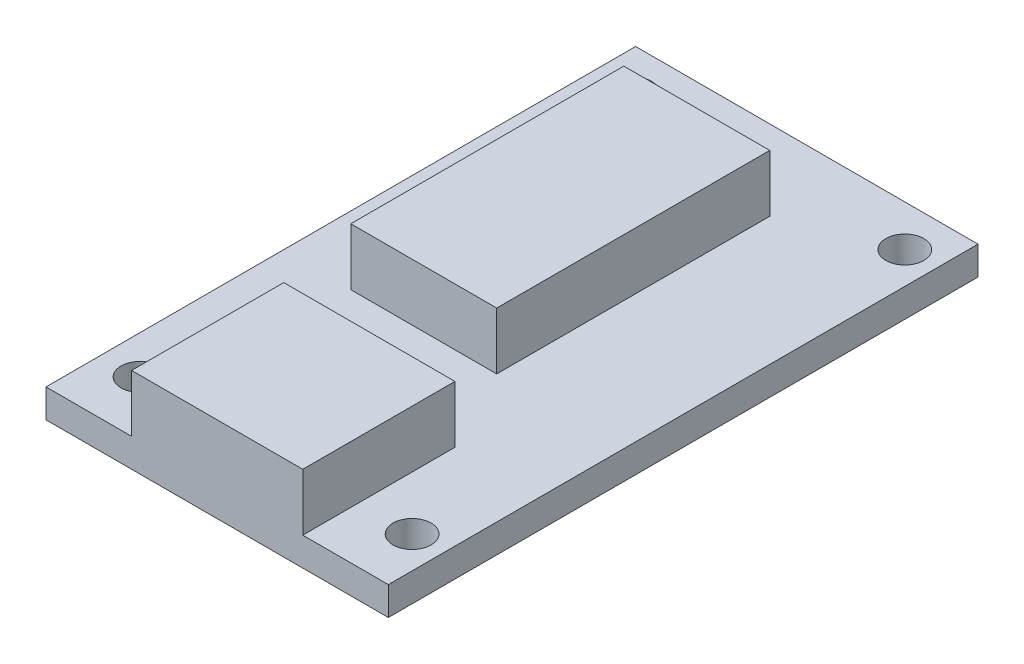
ISO-10303-21;
HEADER;
FILE_DESCRIPTION(('STEP AP214'),'2;1');
FILE_NAME('part.step','',(''),(''),'','','');
FILE_SCHEMA(('AUTOMOTIVE_DESIGN { 1 0 10303 214 1 1 1 1 }'));
ENDSEC;
DATA;
#1=APPLICATION_CONTEXT('core data for automotive mechanical design processes');
#2=APPLICATION_PROTOCOL_DEFINITION('international standard','automotive_design',2000,#1);
#3=PRODUCT_CONTEXT('',#1,'mechanical');
#4=PRODUCT('Part','Part','',(#3));
#5=PRODUCT_RELATED_PRODUCT_CATEGORY('part','',(#4));
#6=PRODUCT_DEFINITION_FORMATION('','',#4);
#7=PRODUCT_DEFINITION_CONTEXT('part definition',#1,'design');
#8=PRODUCT_DEFINITION('design','',#6,#7);
#9=PRODUCT_DEFINITION_SHAPE('','',#8);
#10=(LENGTH_UNIT() NAMED_UNIT(*) SI_UNIT(.MILLI.,.METRE.));
#11=(NAMED_UNIT(*) PLANE_ANGLE_UNIT() SI_UNIT($,.RADIAN.));
#12=(NAMED_UNIT(*) SI_UNIT($,.STERADIAN.) SOLID_ANGLE_UNIT());
#13=UNCERTAINTY_MEASURE_WITH_UNIT(LENGTH_MEASURE(1.E-05),#10,'distance_accuracy_value','');
#14=(GEOMETRIC_REPRESENTATION_CONTEXT(3) GLOBAL_UNCERTAINTY_ASSIGNED_CONTEXT((#13)) GLOBAL_UNIT_ASSIGNED_CONTEXT((#10,
#11,#12)) REPRESENTATION_CONTEXT('',''));
#15=CARTESIAN_POINT('',(0.,0.,0.));
#16=DIRECTION('',(0.,0.,1.));
#17=DIRECTION('',(1.,0.,0.));
#18=AXIS2_PLACEMENT_3D('',#15,#16,#17);
#19=CARTESIAN_POINT('',(0.,1.5,0.));
#20=DIRECTION('',(0.,1.,0.));
#21=DIRECTION('',(0.,0.,1.));
#22=AXIS2_PLACEMENT_3D('',#19,#20,#21);
#23=PLANE('',#22);
#24=CARTESIAN_POINT('',(16.3202285056813,1.5,-2.92692740810944));
#25=DIRECTION('',(0.,1.,0.));
#26=DIRECTION('',(0.,0.,1.));
#27=AXIS2_PLACEMENT_3D('',#24,#25,#26);
#28=CIRCLE('',#27,1.);
#29=CARTESIAN_POINT('',(16.3202285056813,1.5,-1.92692740810943));
#30=VERTEX_POINT('',#29);
#31=EDGE_CURVE('E249',#30,#30,#28,.T.);
#32=ORIENTED_EDGE('',*,*,#31,.F.);
#33=EDGE_LOOP('',(#32));
#34=FACE_BOUND('',#33,.T.);
#35=CARTESIAN_POINT('',(2.01730364443661,1.5,-28.8325199296558));
#36=DIRECTION('',(0.,1.,0.));
#37=DIRECTION('',(0.,0.,1.));
#38=AXIS2_PLACEMENT_3D('',#35,#36,#37);
#39=CIRCLE('',#38,1.);
#40=CARTESIAN_POINT('',(2.01730364443661,1.5,-27.8325199296558));
#41=VERTEX_POINT('',#40);
#42=EDGE_CURVE('E250',#41,#41,#39,.T.);
#43=ORIENTED_EDGE('',*,*,#42,.F.);
#44=EDGE_LOOP('',(#43));
#45=FACE_BOUND('',#44,.T.);
#46=CARTESIAN_POINT('',(16.3202285056813,1.5,-28.8325199296558));
#47=DIRECTION('',(0.,1.,0.));
#48=DIRECTION('',(0.,0.,1.));
#49=AXIS2_PLACEMENT_3D('',#46,#47,#48);
#50=CIRCLE('',#49,1.);
#51=CARTESIAN_POINT('',(16.3202285056813,1.5,-27.8325199296558));
#52=VERTEX_POINT('',#51);
#53=EDGE_CURVE('E253',#52,#52,#50,.T.);
#54=ORIENTED_EDGE('',*,*,#53,.F.);
#55=EDGE_LOOP('',(#54));
#56=FACE_BOUND('',#55,.T.);
#57=CARTESIAN_POINT('',(2.01730364443661,1.5,-2.92692740810944));
#58=DIRECTION('',(0.,1.,0.));
#59=DIRECTION('',(0.,0.,1.));
#60=AXIS2_PLACEMENT_3D('',#57,#58,#59);
#61=CIRCLE('',#60,1.);
#62=CARTESIAN_POINT('',(2.01730364443661,1.5,-1.92692740810944));
#63=VERTEX_POINT('',#62);
#64=EDGE_CURVE('E227',#63,#63,#61,.T.);
#65=ORIENTED_EDGE('',*,*,#64,.F.);
#66=EDGE_LOOP('',(#65));
#67=FACE_BOUND('',#66,.T.);
#68=DIRECTION('',(-1.,0.,0.));
#69=VECTOR('',#68,1.);
#70=CARTESIAN_POINT('',(0.,1.5,-8.));
#71=LINE('',#70,#69);
#72=CARTESIAN_POINT('',(13.5,1.5,-8.));
#73=VERTEX_POINT('',#72);
#74=CARTESIAN_POINT('',(4.5,1.5,-8.));
#75=VERTEX_POINT('',#74);
#76=EDGE_CURVE('E72',#73,#75,#71,.T.);
#77=ORIENTED_EDGE('',*,*,#76,.F.);
#78=DIRECTION('',(0.,0.,1.));
#79=VECTOR('',#78,1.);
#80=CARTESIAN_POINT('',(13.5,1.5,0.));
#81=LINE('',#80,#79);
#82=CARTESIAN_POINT('',(13.5,1.5,0.));
#83=VERTEX_POINT('',#82);
#84=EDGE_CURVE('E193',#73,#83,#81,.T.);
#85=ORIENTED_EDGE('',*,*,#84,.T.);
#86=DIRECTION('',(1.,0.,0.));
#87=VECTOR('',#86,1.);
#88=CARTESIAN_POINT('',(0.,1.5,0.));
#89=LINE('',#88,#87);
#90=CARTESIAN_POINT('',(18.,1.5,0.));
#91=VERTEX_POINT('',#90);
#92=EDGE_CURVE('E199',#83,#91,#89,.T.);
#93=ORIENTED_EDGE('',*,*,#92,.T.);
#94=DIRECTION('',(0.,0.,-1.));
#95=VECTOR('',#94,1.);
#96=CARTESIAN_POINT('',(18.,1.5,0.));
#97=LINE('',#96,#95);
#98=CARTESIAN_POINT('',(18.,1.5,-31.));
#99=VERTEX_POINT('',#98);
#100=EDGE_CURVE('E203',#91,#99,#97,.T.);
#101=ORIENTED_EDGE('',*,*,#100,.T.);
#102=DIRECTION('',(1.,0.,0.));
#103=VECTOR('',#102,1.);
#104=CARTESIAN_POINT('',(0.,1.5,-31.));
#105=LINE('',#104,#103);
#106=CARTESIAN_POINT('',(0.,1.5,-31.));
#107=VERTEX_POINT('',#106);
#108=EDGE_CURVE('E205',#107,#99,#105,.T.);
#109=ORIENTED_EDGE('',*,*,#108,.F.);
#110=DIRECTION('',(0.,0.,-1.));
#111=VECTOR('',#110,1.);
#112=CARTESIAN_POINT('',(0.,1.5,0.));
#113=LINE('',#112,#111);
#114=CARTESIAN_POINT('',(0.,1.5,0.));
#115=VERTEX_POINT('',#114);
#116=EDGE_CURVE('E196',#115,#107,#113,.T.);
#117=ORIENTED_EDGE('',*,*,#116,.F.);
#118=CARTESIAN_POINT('',(4.5,1.5,0.));
#119=VERTEX_POINT('',#118);
#120=EDGE_CURVE('E201',#115,#119,#89,.T.);
#121=ORIENTED_EDGE('',*,*,#120,.T.);
#122=DIRECTION('',(0.,0.,1.));
#123=VECTOR('',#122,1.);
#124=CARTESIAN_POINT('',(4.5,1.5,0.));
#125=LINE('',#124,#123);
#126=EDGE_CURVE('E189',#75,#119,#125,.T.);
#127=ORIENTED_EDGE('',*,*,#126,.F.);
#128=EDGE_LOOP('',(#77,#85,#93,#101,#109,#117,#121,#127));
#129=FACE_BOUND('',#128,.T.);
#130=DIRECTION('',(1.,0.,0.));
#131=VECTOR('',#130,1.);
#132=CARTESIAN_POINT('',(3.58371132864352,1.5,-12.4392175838739));
#133=LINE('',#132,#131);
#134=CARTESIAN_POINT('',(3.58371132864352,1.5,-12.4392175838739));
#135=VERTEX_POINT('',#134);
#136=CARTESIAN_POINT('',(11.2572221747062,1.5,-12.4392175838739));
#137=VERTEX_POINT('',#136);
#138=EDGE_CURVE('E236',#135,#137,#133,.T.);
#139=ORIENTED_EDGE('',*,*,#138,.F.);
#140=DIRECTION('',(0.,0.,1.));
#141=VECTOR('',#140,1.);
#142=CARTESIAN_POINT('',(3.58371132864352,1.5,-26.7947182116203));
#143=LINE('',#142,#141);
#144=CARTESIAN_POINT('',(3.58371132864352,1.5,-26.7947182116203));
#145=VERTEX_POINT('',#144);
#146=EDGE_CURVE('E160',#145,#135,#143,.T.);
#147=ORIENTED_EDGE('',*,*,#146,.F.);
#148=DIRECTION('',(-1.,0.,0.));
#149=VECTOR('',#148,1.);
#150=CARTESIAN_POINT('',(3.58371132864352,1.5,-26.7947182116203));
#151=LINE('',#150,#149);
#152=CARTESIAN_POINT('',(11.2572221747062,1.5,-26.7947182116203));
#153=VERTEX_POINT('',#152);
#154=EDGE_CURVE('E156',#153,#145,#151,.T.);
#155=ORIENTED_EDGE('',*,*,#154,.F.);
#156=DIRECTION('',(0.,0.,-1.));
#157=VECTOR('',#156,1.);
#158=CARTESIAN_POINT('',(11.2572221747062,1.5,-26.7947182116203));
#159=LINE('',#158,#157);
#160=EDGE_CURVE('E238',#137,#153,#159,.T.);
#161=ORIENTED_EDGE('',*,*,#160,.F.);
#162=EDGE_LOOP('',(#139,#147,#155,#161));
#163=FACE_BOUND('',#162,.T.);
#164=ADVANCED_FACE('F47',(#34,#45,#56,#67,#129,#163),#23,.T.);
#165=CARTESIAN_POINT('',(0.,1.5,0.));
#166=DIRECTION('',(-1.,0.,0.));
#167=DIRECTION('',(0.,0.,1.));
#168=AXIS2_PLACEMENT_3D('',#165,#166,#167);
#169=PLANE('',#168);
#170=DIRECTION('',(0.,0.,-1.));
#171=VECTOR('',#170,1.);
#172=CARTESIAN_POINT('',(0.,0.,0.));
#173=LINE('',#172,#171);
#174=CARTESIAN_POINT('',(0.,0.,0.));
#175=VERTEX_POINT('',#174);
#176=CARTESIAN_POINT('',(0.,0.,-31.));
#177=VERTEX_POINT('',#176);
#178=EDGE_CURVE('E195',#175,#177,#173,.T.);
#179=ORIENTED_EDGE('',*,*,#178,.F.);
#180=DIRECTION('',(0.,-1.,0.));
#181=VECTOR('',#180,1.);
#182=CARTESIAN_POINT('',(0.,1.5,0.));
#183=LINE('',#182,#181);
#184=EDGE_CURVE('E11',#115,#175,#183,.T.);
#185=ORIENTED_EDGE('',*,*,#184,.F.);
#186=ORIENTED_EDGE('',*,*,#116,.T.);
#187=DIRECTION('',(0.,-1.,0.));
#188=VECTOR('',#187,1.);
#189=CARTESIAN_POINT('',(0.,1.5,-31.));
#190=LINE('',#189,#188);
#191=EDGE_CURVE('E208',#107,#177,#190,.T.);
#192=ORIENTED_EDGE('',*,*,#191,.T.);
#193=EDGE_LOOP('',(#179,#185,#186,#192));
#194=FACE_BOUND('',#193,.T.);
#195=ADVANCED_FACE('F49',(#194),#169,.T.);
#196=CARTESIAN_POINT('',(0.,1.5,0.));
#197=DIRECTION('',(0.,0.,-1.));
#198=DIRECTION('',(-1.,0.,0.));
#199=AXIS2_PLACEMENT_3D('',#196,#197,#198);
#200=PLANE('',#199);
#201=DIRECTION('',(1.,0.,0.));
#202=VECTOR('',#201,1.);
#203=CARTESIAN_POINT('',(0.,0.,0.));
#204=LINE('',#203,#202);
#205=CARTESIAN_POINT('',(18.,0.,0.));
#206=VERTEX_POINT('',#205);
#207=EDGE_CURVE('E211',#175,#206,#204,.T.);
#208=ORIENTED_EDGE('',*,*,#207,.T.);
#209=DIRECTION('',(0.,-1.,0.));
#210=VECTOR('',#209,1.);
#211=CARTESIAN_POINT('',(18.,1.5,0.));
#212=LINE('',#211,#210);
#213=EDGE_CURVE('E56',#91,#206,#212,.T.);
#214=ORIENTED_EDGE('',*,*,#213,.F.);
#215=ORIENTED_EDGE('',*,*,#92,.F.);
#216=DIRECTION('',(0.,-1.,0.));
#217=VECTOR('',#216,1.);
#218=CARTESIAN_POINT('',(13.5,4.5,0.));
#219=LINE('',#218,#217);
#220=CARTESIAN_POINT('',(13.5,4.5,0.));
#221=VERTEX_POINT('',#220);
#222=EDGE_CURVE('E186',#221,#83,#219,.T.);
#223=ORIENTED_EDGE('',*,*,#222,.F.);
#224=DIRECTION('',(1.,0.,0.));
#225=VECTOR('',#224,1.);
#226=CARTESIAN_POINT('',(0.,4.5,0.));
#227=LINE('',#226,#225);
#228=CARTESIAN_POINT('',(4.5,4.5,0.));
#229=VERTEX_POINT('',#228);
#230=EDGE_CURVE('E162',#229,#221,#227,.T.);
#231=ORIENTED_EDGE('',*,*,#230,.F.);
#232=DIRECTION('',(0.,-1.,0.));
#233=VECTOR('',#232,1.);
#234=CARTESIAN_POINT('',(4.5,4.5,0.));
#235=LINE('',#234,#233);
#236=EDGE_CURVE('E177',#229,#119,#235,.T.);
#237=ORIENTED_EDGE('',*,*,#236,.T.);
#238=ORIENTED_EDGE('',*,*,#120,.F.);
#239=ORIENTED_EDGE('',*,*,#184,.T.);
#240=EDGE_LOOP('',(#208,#214,#215,#223,#231,#237,#238,#239));
#241=FACE_BOUND('',#240,.T.);
#242=ADVANCED_FACE('F313',(#241),#200,.F.);
#243=CARTESIAN_POINT('',(18.,1.5,0.));
#244=DIRECTION('',(-1.,0.,0.));
#245=DIRECTION('',(0.,0.,1.));
#246=AXIS2_PLACEMENT_3D('',#243,#244,#245);
#247=PLANE('',#246);
#248=DIRECTION('',(0.,0.,-1.));
#249=VECTOR('',#248,1.);
#250=CARTESIAN_POINT('',(18.,0.,0.));
#251=LINE('',#250,#249);
#252=CARTESIAN_POINT('',(18.,0.,-31.));
#253=VERTEX_POINT('',#252);
#254=EDGE_CURVE('E213',#206,#253,#251,.T.);
#255=ORIENTED_EDGE('',*,*,#254,.T.);
#256=DIRECTION('',(0.,-1.,0.));
#257=VECTOR('',#256,1.);
#258=CARTESIAN_POINT('',(18.,1.5,-31.));
#259=LINE('',#258,#257);
#260=EDGE_CURVE('E219',#99,#253,#259,.T.);
#261=ORIENTED_EDGE('',*,*,#260,.F.);
#262=ORIENTED_EDGE('',*,*,#100,.F.);
#263=ORIENTED_EDGE('',*,*,#213,.T.);
#264=EDGE_LOOP('',(#255,#261,#262,#263));
#265=FACE_BOUND('',#264,.T.);
#266=ADVANCED_FACE('F310',(#265),#247,.F.);
#267=CARTESIAN_POINT('',(0.,1.5,-31.));
#268=DIRECTION('',(0.,0.,-1.));
#269=DIRECTION('',(-1.,0.,0.));
#270=AXIS2_PLACEMENT_3D('',#267,#268,#269);
#271=PLANE('',#270);
#272=DIRECTION('',(1.,0.,0.));
#273=VECTOR('',#272,1.);
#274=CARTESIAN_POINT('',(0.,0.,-31.));
#275=LINE('',#274,#273);
#276=EDGE_CURVE('E200',#177,#253,#275,.T.);
#277=ORIENTED_EDGE('',*,*,#276,.F.);
#278=ORIENTED_EDGE('',*,*,#191,.F.);
#279=ORIENTED_EDGE('',*,*,#108,.T.);
#280=ORIENTED_EDGE('',*,*,#260,.T.);
#281=EDGE_LOOP('',(#277,#278,#279,#280));
#282=FACE_BOUND('',#281,.T.);
#283=ADVANCED_FACE('F307',(#282),#271,.T.);
#284=CARTESIAN_POINT('',(0.,0.,0.));
#285=DIRECTION('',(0.,1.,0.));
#286=DIRECTION('',(0.,0.,1.));
#287=AXIS2_PLACEMENT_3D('',#284,#285,#286);
#288=PLANE('',#287);
#289=CARTESIAN_POINT('',(16.3202285056813,0.,-2.92692740810944));
#290=DIRECTION('',(0.,1.,0.));
#291=DIRECTION('',(0.,0.,1.));
#292=AXIS2_PLACEMENT_3D('',#289,#290,#291);
#293=CIRCLE('',#292,1.);
#294=CARTESIAN_POINT('',(16.3202285056813,0.,-1.92692740810943));
#295=VERTEX_POINT('',#294);
#296=EDGE_CURVE('E51',#295,#295,#293,.T.);
#297=ORIENTED_EDGE('',*,*,#296,.T.);
#298=EDGE_LOOP('',(#297));
#299=FACE_BOUND('',#298,.T.);
#300=CARTESIAN_POINT('',(2.01730364443661,0.,-28.8325199296558));
#301=DIRECTION('',(0.,1.,0.));
#302=DIRECTION('',(0.,0.,1.));
#303=AXIS2_PLACEMENT_3D('',#300,#301,#302);
#304=CIRCLE('',#303,1.);
#305=CARTESIAN_POINT('',(2.01730364443661,0.,-27.8325199296558));
#306=VERTEX_POINT('',#305);
#307=EDGE_CURVE('E229',#306,#306,#304,.T.);
#308=ORIENTED_EDGE('',*,*,#307,.T.);
#309=EDGE_LOOP('',(#308));
#310=FACE_BOUND('',#309,.T.);
#311=CARTESIAN_POINT('',(16.3202285056813,0.,-28.8325199296558));
#312=DIRECTION('',(0.,1.,0.));
#313=DIRECTION('',(0.,0.,1.));
#314=AXIS2_PLACEMENT_3D('',#311,#312,#313);
#315=CIRCLE('',#314,1.);
#316=CARTESIAN_POINT('',(16.3202285056813,0.,-27.8325199296558));
#317=VERTEX_POINT('',#316);
#318=EDGE_CURVE('E226',#317,#317,#315,.T.);
#319=ORIENTED_EDGE('',*,*,#318,.T.);
#320=EDGE_LOOP('',(#319));
#321=FACE_BOUND('',#320,.T.);
#322=CARTESIAN_POINT('',(2.01730364443661,0.,-2.92692740810944));
#323=DIRECTION('',(0.,1.,0.));
#324=DIRECTION('',(0.,0.,1.));
#325=AXIS2_PLACEMENT_3D('',#322,#323,#324);
#326=CIRCLE('',#325,1.);
#327=CARTESIAN_POINT('',(2.01730364443661,0.,-1.92692740810944));
#328=VERTEX_POINT('',#327);
#329=EDGE_CURVE('E223',#328,#328,#326,.T.);
#330=ORIENTED_EDGE('',*,*,#329,.T.);
#331=EDGE_LOOP('',(#330));
#332=FACE_BOUND('',#331,.T.);
#333=ORIENTED_EDGE('',*,*,#254,.F.);
#334=ORIENTED_EDGE('',*,*,#207,.F.);
#335=ORIENTED_EDGE('',*,*,#178,.T.);
#336=ORIENTED_EDGE('',*,*,#276,.T.);
#337=EDGE_LOOP('',(#333,#334,#335,#336));
#338=FACE_BOUND('',#337,.T.);
#339=ADVANCED_FACE('F302',(#299,#310,#321,#332,#338),#288,.F.);
#340=CARTESIAN_POINT('',(13.5,4.5,0.));
#341=DIRECTION('',(-1.,0.,0.));
#342=DIRECTION('',(0.,0.,1.));
#343=AXIS2_PLACEMENT_3D('',#340,#341,#342);
#344=PLANE('',#343);
#345=ORIENTED_EDGE('',*,*,#84,.F.);
#346=DIRECTION('',(0.,-1.,0.));
#347=VECTOR('',#346,1.);
#348=CARTESIAN_POINT('',(13.5,4.5,-8.));
#349=LINE('',#348,#347);
#350=CARTESIAN_POINT('',(13.5,4.5,-8.));
#351=VERTEX_POINT('',#350);
#352=EDGE_CURVE('E183',#351,#73,#349,.T.);
#353=ORIENTED_EDGE('',*,*,#352,.F.);
#354=DIRECTION('',(0.,0.,-1.));
#355=VECTOR('',#354,1.);
#356=CARTESIAN_POINT('',(13.5,4.5,0.));
#357=LINE('',#356,#355);
#358=EDGE_CURVE('E165',#221,#351,#357,.T.);
#359=ORIENTED_EDGE('',*,*,#358,.F.);
#360=ORIENTED_EDGE('',*,*,#222,.T.);
#361=EDGE_LOOP('',(#345,#353,#359,#360));
#362=FACE_BOUND('',#361,.T.);
#363=ADVANCED_FACE('F299',(#362),#344,.F.);
#364=CARTESIAN_POINT('',(0.,4.5,-8.));
#365=DIRECTION('',(0.,0.,-1.));
#366=DIRECTION('',(-1.,0.,0.));
#367=AXIS2_PLACEMENT_3D('',#364,#365,#366);
#368=PLANE('',#367);
#369=ORIENTED_EDGE('',*,*,#352,.T.);
#370=ORIENTED_EDGE('',*,*,#76,.T.);
#371=DIRECTION('',(0.,-1.,0.));
#372=VECTOR('',#371,1.);
#373=CARTESIAN_POINT('',(4.5,4.5,-8.));
#374=LINE('',#373,#372);
#375=CARTESIAN_POINT('',(4.5,4.5,-8.));
#376=VERTEX_POINT('',#375);
#377=EDGE_CURVE('E180',#376,#75,#374,.T.);
#378=ORIENTED_EDGE('',*,*,#377,.F.);
#379=DIRECTION('',(1.,0.,0.));
#380=VECTOR('',#379,1.);
#381=CARTESIAN_POINT('',(0.,4.5,-8.));
#382=LINE('',#381,#380);
#383=EDGE_CURVE('E171',#376,#351,#382,.T.);
#384=ORIENTED_EDGE('',*,*,#383,.T.);
#385=EDGE_LOOP('',(#369,#370,#378,#384));
#386=FACE_BOUND('',#385,.T.);
#387=ADVANCED_FACE('F295',(#386),#368,.T.);
#388=CARTESIAN_POINT('',(4.5,4.5,0.));
#389=DIRECTION('',(-1.,0.,0.));
#390=DIRECTION('',(0.,0.,1.));
#391=AXIS2_PLACEMENT_3D('',#388,#389,#390);
#392=PLANE('',#391);
#393=ORIENTED_EDGE('',*,*,#377,.T.);
#394=ORIENTED_EDGE('',*,*,#126,.T.);
#395=ORIENTED_EDGE('',*,*,#236,.F.);
#396=DIRECTION('',(0.,0.,-1.));
#397=VECTOR('',#396,1.);
#398=CARTESIAN_POINT('',(4.5,4.5,0.));
#399=LINE('',#398,#397);
#400=EDGE_CURVE('E174',#229,#376,#399,.T.);
#401=ORIENTED_EDGE('',*,*,#400,.T.);
#402=EDGE_LOOP('',(#393,#394,#395,#401));
#403=FACE_BOUND('',#402,.T.);
#404=ADVANCED_FACE('F291',(#403),#392,.T.);
#405=CARTESIAN_POINT('',(0.,4.5,0.));
#406=DIRECTION('',(0.,1.,0.));
#407=DIRECTION('',(0.,0.,1.));
#408=AXIS2_PLACEMENT_3D('',#405,#406,#407);
#409=PLANE('',#408);
#410=ORIENTED_EDGE('',*,*,#230,.T.);
#411=ORIENTED_EDGE('',*,*,#358,.T.);
#412=ORIENTED_EDGE('',*,*,#383,.F.);
#413=ORIENTED_EDGE('',*,*,#400,.F.);
#414=EDGE_LOOP('',(#410,#411,#412,#413));
#415=FACE_BOUND('',#414,.T.);
#416=ADVANCED_FACE('F288',(#415),#409,.T.);
#417=CARTESIAN_POINT('',(3.58371132864352,4.5,-26.7947182116203));
#418=DIRECTION('',(1.,0.,0.));
#419=DIRECTION('',(0.,0.,-1.));
#420=AXIS2_PLACEMENT_3D('',#417,#418,#419);
#421=PLANE('',#420);
#422=ORIENTED_EDGE('',*,*,#146,.T.);
#423=DIRECTION('',(0.,-1.,0.));
#424=VECTOR('',#423,1.);
#425=CARTESIAN_POINT('',(3.58371132864352,4.5,-12.4392175838739));
#426=LINE('',#425,#424);
#427=CARTESIAN_POINT('',(3.58371132864352,4.5,-12.4392175838739));
#428=VERTEX_POINT('',#427);
#429=EDGE_CURVE('E141',#428,#135,#426,.T.);
#430=ORIENTED_EDGE('',*,*,#429,.F.);
#431=DIRECTION('',(0.,0.,1.));
#432=VECTOR('',#431,1.);
#433=CARTESIAN_POINT('',(3.58371132864352,4.5,-26.7947182116203));
#434=LINE('',#433,#432);
#435=CARTESIAN_POINT('',(3.58371132864352,4.5,-26.7947182116203));
#436=VERTEX_POINT('',#435);
#437=EDGE_CURVE('E148',#436,#428,#434,.T.);
#438=ORIENTED_EDGE('',*,*,#437,.F.);
#439=DIRECTION('',(0.,-1.,0.));
#440=VECTOR('',#439,1.);
#441=CARTESIAN_POINT('',(3.58371132864352,4.5,-26.7947182116203));
#442=LINE('',#441,#440);
#443=EDGE_CURVE('E245',#436,#145,#442,.T.);
#444=ORIENTED_EDGE('',*,*,#443,.T.);
#445=EDGE_LOOP('',(#422,#430,#438,#444));
#446=FACE_BOUND('',#445,.T.);
#447=ADVANCED_FACE('F158',(#446),#421,.F.);
#448=CARTESIAN_POINT('',(3.58371132864352,4.5,-12.4392175838739));
#449=DIRECTION('',(0.,0.,-1.));
#450=DIRECTION('',(-1.,0.,0.));
#451=AXIS2_PLACEMENT_3D('',#448,#449,#450);
#452=PLANE('',#451);
#453=ORIENTED_EDGE('',*,*,#138,.T.);
#454=DIRECTION('',(0.,-1.,0.));
#455=VECTOR('',#454,1.);
#456=CARTESIAN_POINT('',(11.2572221747062,4.5,-12.4392175838739));
#457=LINE('',#456,#455);
#458=CARTESIAN_POINT('',(11.2572221747062,4.5,-12.4392175838739));
#459=VERTEX_POINT('',#458);
#460=EDGE_CURVE('E144',#459,#137,#457,.T.);
#461=ORIENTED_EDGE('',*,*,#460,.F.);
#462=DIRECTION('',(1.,0.,0.));
#463=VECTOR('',#462,1.);
#464=CARTESIAN_POINT('',(3.58371132864352,4.5,-12.4392175838739));
#465=LINE('',#464,#463);
#466=EDGE_CURVE('E137',#428,#459,#465,.T.);
#467=ORIENTED_EDGE('',*,*,#466,.F.);
#468=ORIENTED_EDGE('',*,*,#429,.T.);
#469=EDGE_LOOP('',(#453,#461,#467,#468));
#470=FACE_BOUND('',#469,.T.);
#471=ADVANCED_FACE('F139',(#470),#452,.F.);
#472=CARTESIAN_POINT('',(11.2572221747062,4.5,-26.7947182116203));
#473=DIRECTION('',(-1.,0.,0.));
#474=DIRECTION('',(0.,0.,1.));
#475=AXIS2_PLACEMENT_3D('',#472,#473,#474);
#476=PLANE('',#475);
#477=ORIENTED_EDGE('',*,*,#160,.T.);
#478=DIRECTION('',(0.,-1.,0.));
#479=VECTOR('',#478,1.);
#480=CARTESIAN_POINT('',(11.2572221747062,4.5,-26.7947182116203));
#481=LINE('',#480,#479);
#482=CARTESIAN_POINT('',(11.2572221747062,4.5,-26.7947182116203));
#483=VERTEX_POINT('',#482);
#484=EDGE_CURVE('E64',#483,#153,#481,.T.);
#485=ORIENTED_EDGE('',*,*,#484,.F.);
#486=DIRECTION('',(0.,0.,-1.));
#487=VECTOR('',#486,1.);
#488=CARTESIAN_POINT('',(11.2572221747062,4.5,-26.7947182116203));
#489=LINE('',#488,#487);
#490=EDGE_CURVE('E147',#459,#483,#489,.T.);
#491=ORIENTED_EDGE('',*,*,#490,.F.);
#492=ORIENTED_EDGE('',*,*,#460,.T.);
#493=EDGE_LOOP('',(#477,#485,#491,#492));
#494=FACE_BOUND('',#493,.T.);
#495=ADVANCED_FACE('F271',(#494),#476,.F.);
#496=CARTESIAN_POINT('',(3.58371132864352,4.5,-26.7947182116203));
#497=DIRECTION('',(0.,0.,1.));
#498=DIRECTION('',(1.,0.,0.));
#499=AXIS2_PLACEMENT_3D('',#496,#497,#498);
#500=PLANE('',#499);
#501=ORIENTED_EDGE('',*,*,#154,.T.);
#502=ORIENTED_EDGE('',*,*,#443,.F.);
#503=DIRECTION('',(-1.,0.,0.));
#504=VECTOR('',#503,1.);
#505=CARTESIAN_POINT('',(3.58371132864352,4.5,-26.7947182116203));
#506=LINE('',#505,#504);
#507=EDGE_CURVE('E152',#483,#436,#506,.T.);
#508=ORIENTED_EDGE('',*,*,#507,.F.);
#509=ORIENTED_EDGE('',*,*,#484,.T.);
#510=EDGE_LOOP('',(#501,#502,#508,#509));
#511=FACE_BOUND('',#510,.T.);
#512=ADVANCED_FACE('F272',(#511),#500,.F.);
#513=CARTESIAN_POINT('',(0.,4.5,0.));
#514=DIRECTION('',(0.,1.,0.));
#515=DIRECTION('',(0.,0.,1.));
#516=AXIS2_PLACEMENT_3D('',#513,#514,#515);
#517=PLANE('',#516);
#518=ORIENTED_EDGE('',*,*,#437,.T.);
#519=ORIENTED_EDGE('',*,*,#466,.T.);
#520=ORIENTED_EDGE('',*,*,#490,.T.);
#521=ORIENTED_EDGE('',*,*,#507,.T.);
#522=EDGE_LOOP('',(#518,#519,#520,#521));
#523=FACE_BOUND('',#522,.T.);
#524=ADVANCED_FACE('F151',(#523),#517,.T.);
#525=CARTESIAN_POINT('',(2.01730364443661,-8.5,-2.92692740810944));
#526=DIRECTION('',(0.,1.,0.));
#527=DIRECTION('',(0.,0.,1.));
#528=AXIS2_PLACEMENT_3D('',#525,#526,#527);
#529=CYLINDRICAL_SURFACE('',#528,1.);
#530=ORIENTED_EDGE('',*,*,#64,.T.);
#531=EDGE_LOOP('',(#530));
#532=FACE_BOUND('',#531,.T.);
#533=ORIENTED_EDGE('',*,*,#329,.F.);
#534=EDGE_LOOP('',(#533));
#535=FACE_BOUND('',#534,.T.);
#536=ADVANCED_FACE('F279',(#532,#535),#529,.F.);
#537=CARTESIAN_POINT('',(16.3202285056813,-8.5,-28.8325199296558));
#538=DIRECTION('',(0.,1.,0.));
#539=DIRECTION('',(0.,0.,1.));
#540=AXIS2_PLACEMENT_3D('',#537,#538,#539);
#541=CYLINDRICAL_SURFACE('',#540,1.);
#542=ORIENTED_EDGE('',*,*,#53,.T.);
#543=EDGE_LOOP('',(#542));
#544=FACE_BOUND('',#543,.T.);
#545=ORIENTED_EDGE('',*,*,#318,.F.);
#546=EDGE_LOOP('',(#545));
#547=FACE_BOUND('',#546,.T.);
#548=ADVANCED_FACE('F259',(#544,#547),#541,.F.);
#549=CARTESIAN_POINT('',(2.01730364443661,-8.5,-28.8325199296558));
#550=DIRECTION('',(0.,1.,0.));
#551=DIRECTION('',(0.,0.,1.));
#552=AXIS2_PLACEMENT_3D('',#549,#550,#551);
#553=CYLINDRICAL_SURFACE('',#552,1.);
#554=ORIENTED_EDGE('',*,*,#42,.T.);
#555=EDGE_LOOP('',(#554));
#556=FACE_BOUND('',#555,.T.);
#557=ORIENTED_EDGE('',*,*,#307,.F.);
#558=EDGE_LOOP('',(#557));
#559=FACE_BOUND('',#558,.T.);
#560=ADVANCED_FACE('F447',(#556,#559),#553,.F.);
#561=CARTESIAN_POINT('',(16.3202285056813,-8.5,-2.92692740810944));
#562=DIRECTION('',(0.,1.,0.));
#563=DIRECTION('',(0.,0.,1.));
#564=AXIS2_PLACEMENT_3D('',#561,#562,#563);
#565=CYLINDRICAL_SURFACE('',#564,1.);
#566=ORIENTED_EDGE('',*,*,#31,.T.);
#567=EDGE_LOOP('',(#566));
#568=FACE_BOUND('',#567,.T.);
#569=ORIENTED_EDGE('',*,*,#296,.F.);
#570=EDGE_LOOP('',(#569));
#571=FACE_BOUND('',#570,.T.);
#572=ADVANCED_FACE('F456',(#568,#571),#565,.F.);
#573=CLOSED_SHELL('',(#164,#195,#242,#266,#283,#339,#363,#387,#404,#416,#447,#471,#495,#512,
#524,#536,#548,#560,#572));
#574=MANIFOLD_SOLID_BREP('B2',#573);
#575=ADVANCED_BREP_SHAPE_REPRESENTATION('',(#18,#574),#14);
#576=SHAPE_DEFINITION_REPRESENTATION(#9,#575);
ENDSEC;
END-ISO-10303-21;
